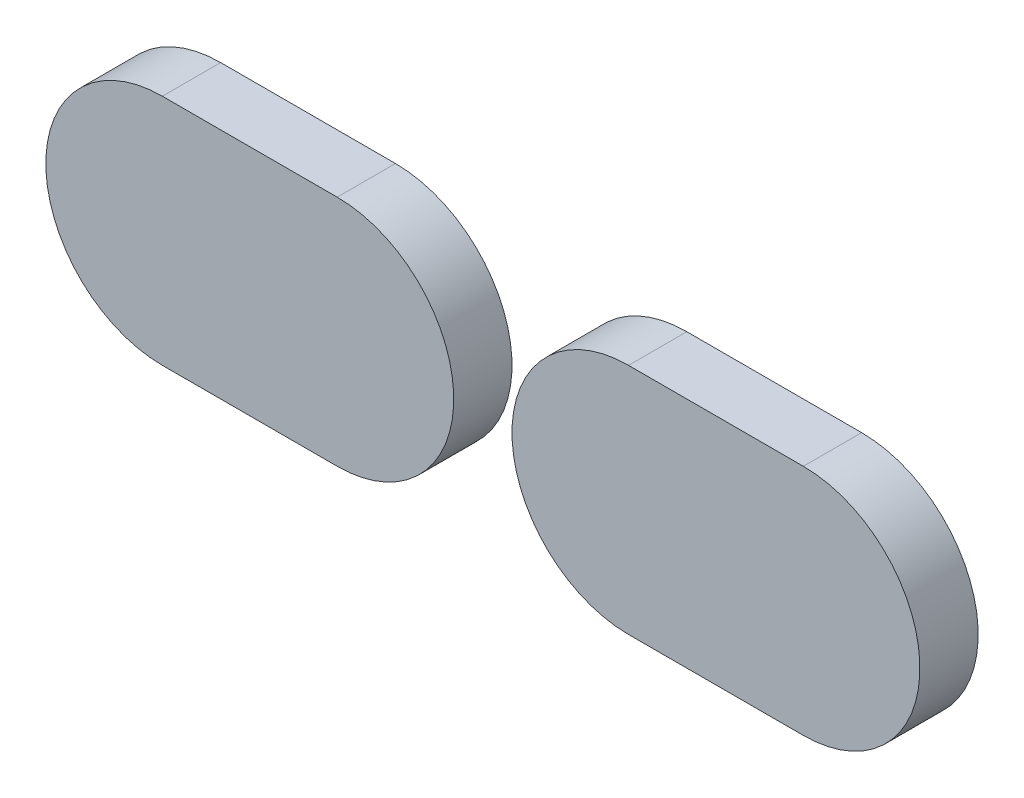
ISO-10303-21;
HEADER;
FILE_DESCRIPTION(('STEP AP214'),'2;1');
FILE_NAME('part.step','',(''),(''),'','','');
FILE_SCHEMA(('AUTOMOTIVE_DESIGN { 1 0 10303 214 1 1 1 1 }'));
ENDSEC;
DATA;
#1=APPLICATION_CONTEXT('core data for automotive mechanical design processes');
#2=APPLICATION_PROTOCOL_DEFINITION('international standard','automotive_design',2000,#1);
#3=PRODUCT_CONTEXT('',#1,'mechanical');
#4=PRODUCT('Part','Part','',(#3));
#5=PRODUCT_RELATED_PRODUCT_CATEGORY('part','',(#4));
#6=PRODUCT_DEFINITION_FORMATION('','',#4);
#7=PRODUCT_DEFINITION_CONTEXT('part definition',#1,'design');
#8=PRODUCT_DEFINITION('design','',#6,#7);
#9=PRODUCT_DEFINITION_SHAPE('','',#8);
#10=(LENGTH_UNIT() NAMED_UNIT(*) SI_UNIT(.MILLI.,.METRE.));
#11=(NAMED_UNIT(*) PLANE_ANGLE_UNIT() SI_UNIT($,.RADIAN.));
#12=(NAMED_UNIT(*) SI_UNIT($,.STERADIAN.) SOLID_ANGLE_UNIT());
#13=UNCERTAINTY_MEASURE_WITH_UNIT(LENGTH_MEASURE(1.E-05),#10,'distance_accuracy_value','');
#14=(GEOMETRIC_REPRESENTATION_CONTEXT(3) GLOBAL_UNCERTAINTY_ASSIGNED_CONTEXT((#13)) GLOBAL_UNIT_ASSIGNED_CONTEXT((#10,
#11,#12)) REPRESENTATION_CONTEXT('',''));
#15=CARTESIAN_POINT('',(0.,0.,0.));
#16=DIRECTION('',(0.,0.,1.));
#17=DIRECTION('',(1.,0.,0.));
#18=AXIS2_PLACEMENT_3D('',#15,#16,#17);
#19=CARTESIAN_POINT('',(80.,0.,10.));
#20=DIRECTION('',(0.,0.,-1.));
#21=DIRECTION('',(-1.,0.,0.));
#22=AXIS2_PLACEMENT_3D('',#19,#20,#21);
#23=CYLINDRICAL_SURFACE('',#22,20.);
#24=CARTESIAN_POINT('',(80.,0.,0.));
#25=DIRECTION('',(0.,0.,1.));
#26=DIRECTION('',(1.,0.,0.));
#27=AXIS2_PLACEMENT_3D('',#24,#25,#26);
#28=CIRCLE('',#27,20.);
#29=CARTESIAN_POINT('',(80.,20.,0.));
#30=VERTEX_POINT('',#29);
#31=CARTESIAN_POINT('',(80.,-20.,0.));
#32=VERTEX_POINT('',#31);
#33=EDGE_CURVE('E13',#30,#32,#28,.T.);
#34=ORIENTED_EDGE('',*,*,#33,.T.);
#35=DIRECTION('',(0.,0.,-1.));
#36=VECTOR('',#35,1.);
#37=CARTESIAN_POINT('',(80.,-20.,10.));
#38=LINE('',#37,#36);
#39=CARTESIAN_POINT('',(80.,-20.,10.));
#40=VERTEX_POINT('',#39);
#41=EDGE_CURVE('E135',#40,#32,#38,.T.);
#42=ORIENTED_EDGE('',*,*,#41,.F.);
#43=CARTESIAN_POINT('',(80.,0.,10.));
#44=DIRECTION('',(0.,0.,1.));
#45=DIRECTION('',(1.,0.,0.));
#46=AXIS2_PLACEMENT_3D('',#43,#44,#45);
#47=CIRCLE('',#46,20.);
#48=CARTESIAN_POINT('',(80.,20.,10.));
#49=VERTEX_POINT('',#48);
#50=EDGE_CURVE('E59',#49,#40,#47,.T.);
#51=ORIENTED_EDGE('',*,*,#50,.F.);
#52=DIRECTION('',(0.,0.,-1.));
#53=VECTOR('',#52,1.);
#54=CARTESIAN_POINT('',(80.,20.,10.));
#55=LINE('',#54,#53);
#56=EDGE_CURVE('E115',#49,#30,#55,.T.);
#57=ORIENTED_EDGE('',*,*,#56,.T.);
#58=EDGE_LOOP('',(#34,#42,#51,#57));
#59=FACE_BOUND('',#58,.T.);
#60=ADVANCED_FACE('F55',(#59),#23,.T.);
#61=CARTESIAN_POINT('',(80.,-20.,10.));
#62=DIRECTION('',(0.,1.,0.));
#63=DIRECTION('',(0.,0.,1.));
#64=AXIS2_PLACEMENT_3D('',#61,#62,#63);
#65=PLANE('',#64);
#66=DIRECTION('',(1.,0.,0.));
#67=VECTOR('',#66,1.);
#68=CARTESIAN_POINT('',(80.,-20.,0.));
#69=LINE('',#68,#67);
#70=CARTESIAN_POINT('',(110.,-20.,0.));
#71=VERTEX_POINT('',#70);
#72=EDGE_CURVE('E66',#32,#71,#69,.T.);
#73=ORIENTED_EDGE('',*,*,#72,.T.);
#74=DIRECTION('',(0.,0.,-1.));
#75=VECTOR('',#74,1.);
#76=CARTESIAN_POINT('',(110.,-20.,10.));
#77=LINE('',#76,#75);
#78=CARTESIAN_POINT('',(110.,-20.,10.));
#79=VERTEX_POINT('',#78);
#80=EDGE_CURVE('E111',#79,#71,#77,.T.);
#81=ORIENTED_EDGE('',*,*,#80,.F.);
#82=DIRECTION('',(1.,0.,0.));
#83=VECTOR('',#82,1.);
#84=CARTESIAN_POINT('',(80.,-20.,10.));
#85=LINE('',#84,#83);
#86=EDGE_CURVE('E90',#40,#79,#85,.T.);
#87=ORIENTED_EDGE('',*,*,#86,.F.);
#88=ORIENTED_EDGE('',*,*,#41,.T.);
#89=EDGE_LOOP('',(#73,#81,#87,#88));
#90=FACE_BOUND('',#89,.T.);
#91=ADVANCED_FACE('F138',(#90),#65,.F.);
#92=CARTESIAN_POINT('',(110.,0.,10.));
#93=DIRECTION('',(0.,0.,-1.));
#94=DIRECTION('',(-1.,0.,0.));
#95=AXIS2_PLACEMENT_3D('',#92,#93,#94);
#96=CYLINDRICAL_SURFACE('',#95,20.);
#97=CARTESIAN_POINT('',(110.,0.,0.));
#98=DIRECTION('',(0.,0.,1.));
#99=DIRECTION('',(1.,0.,0.));
#100=AXIS2_PLACEMENT_3D('',#97,#98,#99);
#101=CIRCLE('',#100,20.);
#102=CARTESIAN_POINT('',(110.,20.,0.));
#103=VERTEX_POINT('',#102);
#104=EDGE_CURVE('E106',#71,#103,#101,.T.);
#105=ORIENTED_EDGE('',*,*,#104,.T.);
#106=DIRECTION('',(0.,0.,-1.));
#107=VECTOR('',#106,1.);
#108=CARTESIAN_POINT('',(110.,20.,10.));
#109=LINE('',#108,#107);
#110=CARTESIAN_POINT('',(110.,20.,10.));
#111=VERTEX_POINT('',#110);
#112=EDGE_CURVE('E109',#111,#103,#109,.T.);
#113=ORIENTED_EDGE('',*,*,#112,.F.);
#114=CARTESIAN_POINT('',(110.,0.,10.));
#115=DIRECTION('',(0.,0.,1.));
#116=DIRECTION('',(1.,0.,0.));
#117=AXIS2_PLACEMENT_3D('',#114,#115,#116);
#118=CIRCLE('',#117,20.);
#119=EDGE_CURVE('E125',#79,#111,#118,.T.);
#120=ORIENTED_EDGE('',*,*,#119,.F.);
#121=ORIENTED_EDGE('',*,*,#80,.T.);
#122=EDGE_LOOP('',(#105,#113,#120,#121));
#123=FACE_BOUND('',#122,.T.);
#124=ADVANCED_FACE('F107',(#123),#96,.T.);
#125=CARTESIAN_POINT('',(80.,20.,10.));
#126=DIRECTION('',(0.,-1.,0.));
#127=DIRECTION('',(0.,0.,-1.));
#128=AXIS2_PLACEMENT_3D('',#125,#126,#127);
#129=PLANE('',#128);
#130=DIRECTION('',(-1.,0.,0.));
#131=VECTOR('',#130,1.);
#132=CARTESIAN_POINT('',(80.,20.,0.));
#133=LINE('',#132,#131);
#134=EDGE_CURVE('E100',#103,#30,#133,.T.);
#135=ORIENTED_EDGE('',*,*,#134,.T.);
#136=ORIENTED_EDGE('',*,*,#56,.F.);
#137=DIRECTION('',(-1.,0.,0.));
#138=VECTOR('',#137,1.);
#139=CARTESIAN_POINT('',(80.,20.,10.));
#140=LINE('',#139,#138);
#141=EDGE_CURVE('E114',#111,#49,#140,.T.);
#142=ORIENTED_EDGE('',*,*,#141,.F.);
#143=ORIENTED_EDGE('',*,*,#112,.T.);
#144=EDGE_LOOP('',(#135,#136,#142,#143));
#145=FACE_BOUND('',#144,.T.);
#146=ADVANCED_FACE('F113',(#145),#129,.F.);
#147=CARTESIAN_POINT('',(80.,0.,10.));
#148=DIRECTION('',(0.,0.,1.));
#149=DIRECTION('',(1.,0.,0.));
#150=AXIS2_PLACEMENT_3D('',#147,#148,#149);
#151=PLANE('',#150);
#152=ORIENTED_EDGE('',*,*,#50,.T.);
#153=ORIENTED_EDGE('',*,*,#86,.T.);
#154=ORIENTED_EDGE('',*,*,#119,.T.);
#155=ORIENTED_EDGE('',*,*,#141,.T.);
#156=EDGE_LOOP('',(#152,#153,#154,#155));
#157=FACE_BOUND('',#156,.T.);
#158=ADVANCED_FACE('F57',(#157),#151,.T.);
#159=CARTESIAN_POINT('',(80.,0.,0.));
#160=DIRECTION('',(0.,0.,1.));
#161=DIRECTION('',(1.,0.,0.));
#162=AXIS2_PLACEMENT_3D('',#159,#160,#161);
#163=PLANE('',#162);
#164=ORIENTED_EDGE('',*,*,#33,.F.);
#165=ORIENTED_EDGE('',*,*,#134,.F.);
#166=ORIENTED_EDGE('',*,*,#104,.F.);
#167=ORIENTED_EDGE('',*,*,#72,.F.);
#168=EDGE_LOOP('',(#164,#165,#166,#167));
#169=FACE_BOUND('',#168,.T.);
#170=ADVANCED_FACE('F117',(#169),#163,.F.);
#171=CLOSED_SHELL('',(#60,#91,#124,#146,#158,#170));
#172=MANIFOLD_SOLID_BREP('B2',#171);
#173=CARTESIAN_POINT('',(0.,0.,10.));
#174=DIRECTION('',(0.,0.,-1.));
#175=DIRECTION('',(-1.,0.,0.));
#176=AXIS2_PLACEMENT_3D('',#173,#174,#175);
#177=CYLINDRICAL_SURFACE('',#176,20.);
#178=CARTESIAN_POINT('',(0.,0.,0.));
#179=DIRECTION('',(0.,0.,1.));
#180=DIRECTION('',(1.,0.,0.));
#181=AXIS2_PLACEMENT_3D('',#178,#179,#180);
#182=CIRCLE('',#181,20.);
#183=CARTESIAN_POINT('',(0.,20.,0.));
#184=VERTEX_POINT('',#183);
#185=CARTESIAN_POINT('',(0.,-20.,0.));
#186=VERTEX_POINT('',#185);
#187=EDGE_CURVE('E272',#184,#186,#182,.T.);
#188=ORIENTED_EDGE('',*,*,#187,.T.);
#189=DIRECTION('',(0.,0.,-1.));
#190=VECTOR('',#189,1.);
#191=CARTESIAN_POINT('',(0.,-20.,10.));
#192=LINE('',#191,#190);
#193=CARTESIAN_POINT('',(0.,-20.,10.));
#194=VERTEX_POINT('',#193);
#195=EDGE_CURVE('E53',#194,#186,#192,.T.);
#196=ORIENTED_EDGE('',*,*,#195,.F.);
#197=CARTESIAN_POINT('',(0.,0.,10.));
#198=DIRECTION('',(0.,0.,1.));
#199=DIRECTION('',(1.,0.,0.));
#200=AXIS2_PLACEMENT_3D('',#197,#198,#199);
#201=CIRCLE('',#200,20.);
#202=CARTESIAN_POINT('',(0.,20.,10.));
#203=VERTEX_POINT('',#202);
#204=EDGE_CURVE('E241',#203,#194,#201,.T.);
#205=ORIENTED_EDGE('',*,*,#204,.F.);
#206=DIRECTION('',(0.,0.,-1.));
#207=VECTOR('',#206,1.);
#208=CARTESIAN_POINT('',(0.,20.,10.));
#209=LINE('',#208,#207);
#210=EDGE_CURVE('E252',#203,#184,#209,.T.);
#211=ORIENTED_EDGE('',*,*,#210,.T.);
#212=EDGE_LOOP('',(#188,#196,#205,#211));
#213=FACE_BOUND('',#212,.T.);
#214=ADVANCED_FACE('F190',(#213),#177,.T.);
#215=CARTESIAN_POINT('',(0.,-20.,10.));
#216=DIRECTION('',(0.,1.,0.));
#217=DIRECTION('',(0.,0.,1.));
#218=AXIS2_PLACEMENT_3D('',#215,#216,#217);
#219=PLANE('',#218);
#220=DIRECTION('',(1.,0.,0.));
#221=VECTOR('',#220,1.);
#222=CARTESIAN_POINT('',(0.,-20.,0.));
#223=LINE('',#222,#221);
#224=CARTESIAN_POINT('',(30.,-20.,0.));
#225=VERTEX_POINT('',#224);
#226=EDGE_CURVE('E246',#186,#225,#223,.T.);
#227=ORIENTED_EDGE('',*,*,#226,.T.);
#228=DIRECTION('',(0.,0.,-1.));
#229=VECTOR('',#228,1.);
#230=CARTESIAN_POINT('',(30.,-20.,10.));
#231=LINE('',#230,#229);
#232=CARTESIAN_POINT('',(30.,-20.,10.));
#233=VERTEX_POINT('',#232);
#234=EDGE_CURVE('E198',#233,#225,#231,.T.);
#235=ORIENTED_EDGE('',*,*,#234,.F.);
#236=DIRECTION('',(1.,0.,0.));
#237=VECTOR('',#236,1.);
#238=CARTESIAN_POINT('',(0.,-20.,10.));
#239=LINE('',#238,#237);
#240=EDGE_CURVE('E236',#194,#233,#239,.T.);
#241=ORIENTED_EDGE('',*,*,#240,.F.);
#242=ORIENTED_EDGE('',*,*,#195,.T.);
#243=EDGE_LOOP('',(#227,#235,#241,#242));
#244=FACE_BOUND('',#243,.T.);
#245=ADVANCED_FACE('F245',(#244),#219,.F.);
#246=CARTESIAN_POINT('',(30.,0.,10.));
#247=DIRECTION('',(0.,0.,-1.));
#248=DIRECTION('',(-1.,0.,0.));
#249=AXIS2_PLACEMENT_3D('',#246,#247,#248);
#250=CYLINDRICAL_SURFACE('',#249,20.);
#251=CARTESIAN_POINT('',(30.,0.,0.));
#252=DIRECTION('',(0.,0.,1.));
#253=DIRECTION('',(1.,0.,0.));
#254=AXIS2_PLACEMENT_3D('',#251,#252,#253);
#255=CIRCLE('',#254,20.);
#256=CARTESIAN_POINT('',(30.,20.,0.));
#257=VERTEX_POINT('',#256);
#258=EDGE_CURVE('E223',#225,#257,#255,.T.);
#259=ORIENTED_EDGE('',*,*,#258,.T.);
#260=DIRECTION('',(0.,0.,-1.));
#261=VECTOR('',#260,1.);
#262=CARTESIAN_POINT('',(30.,20.,10.));
#263=LINE('',#262,#261);
#264=CARTESIAN_POINT('',(30.,20.,10.));
#265=VERTEX_POINT('',#264);
#266=EDGE_CURVE('E247',#265,#257,#263,.T.);
#267=ORIENTED_EDGE('',*,*,#266,.F.);
#268=CARTESIAN_POINT('',(30.,0.,10.));
#269=DIRECTION('',(0.,0.,1.));
#270=DIRECTION('',(1.,0.,0.));
#271=AXIS2_PLACEMENT_3D('',#268,#269,#270);
#272=CIRCLE('',#271,20.);
#273=EDGE_CURVE('E239',#233,#265,#272,.T.);
#274=ORIENTED_EDGE('',*,*,#273,.F.);
#275=ORIENTED_EDGE('',*,*,#234,.T.);
#276=EDGE_LOOP('',(#259,#267,#274,#275));
#277=FACE_BOUND('',#276,.T.);
#278=ADVANCED_FACE('F248',(#277),#250,.T.);
#279=CARTESIAN_POINT('',(0.,20.,10.));
#280=DIRECTION('',(0.,-1.,0.));
#281=DIRECTION('',(0.,0.,-1.));
#282=AXIS2_PLACEMENT_3D('',#279,#280,#281);
#283=PLANE('',#282);
#284=DIRECTION('',(-1.,0.,0.));
#285=VECTOR('',#284,1.);
#286=CARTESIAN_POINT('',(0.,20.,0.));
#287=LINE('',#286,#285);
#288=EDGE_CURVE('E229',#257,#184,#287,.T.);
#289=ORIENTED_EDGE('',*,*,#288,.T.);
#290=ORIENTED_EDGE('',*,*,#210,.F.);
#291=DIRECTION('',(-1.,0.,0.));
#292=VECTOR('',#291,1.);
#293=CARTESIAN_POINT('',(0.,20.,10.));
#294=LINE('',#293,#292);
#295=EDGE_CURVE('E206',#265,#203,#294,.T.);
#296=ORIENTED_EDGE('',*,*,#295,.F.);
#297=ORIENTED_EDGE('',*,*,#266,.T.);
#298=EDGE_LOOP('',(#289,#290,#296,#297));
#299=FACE_BOUND('',#298,.T.);
#300=ADVANCED_FACE('F267',(#299),#283,.F.);
#301=CARTESIAN_POINT('',(0.,0.,10.));
#302=DIRECTION('',(0.,0.,1.));
#303=DIRECTION('',(1.,0.,0.));
#304=AXIS2_PLACEMENT_3D('',#301,#302,#303);
#305=PLANE('',#304);
#306=ORIENTED_EDGE('',*,*,#204,.T.);
#307=ORIENTED_EDGE('',*,*,#240,.T.);
#308=ORIENTED_EDGE('',*,*,#273,.T.);
#309=ORIENTED_EDGE('',*,*,#295,.T.);
#310=EDGE_LOOP('',(#306,#307,#308,#309));
#311=FACE_BOUND('',#310,.T.);
#312=ADVANCED_FACE('F237',(#311),#305,.T.);
#313=CARTESIAN_POINT('',(0.,0.,0.));
#314=DIRECTION('',(0.,0.,1.));
#315=DIRECTION('',(1.,0.,0.));
#316=AXIS2_PLACEMENT_3D('',#313,#314,#315);
#317=PLANE('',#316);
#318=ORIENTED_EDGE('',*,*,#187,.F.);
#319=ORIENTED_EDGE('',*,*,#288,.F.);
#320=ORIENTED_EDGE('',*,*,#258,.F.);
#321=ORIENTED_EDGE('',*,*,#226,.F.);
#322=EDGE_LOOP('',(#318,#319,#320,#321));
#323=FACE_BOUND('',#322,.T.);
#324=ADVANCED_FACE('F270',(#323),#317,.F.);
#325=CLOSED_SHELL('',(#214,#245,#278,#300,#312,#324));
#326=MANIFOLD_SOLID_BREP('B7',#325);
#327=ADVANCED_BREP_SHAPE_REPRESENTATION('',(#18,#172,#326),#14);
#328=SHAPE_DEFINITION_REPRESENTATION(#9,#327);
ENDSEC;
END-ISO-10303-21;
